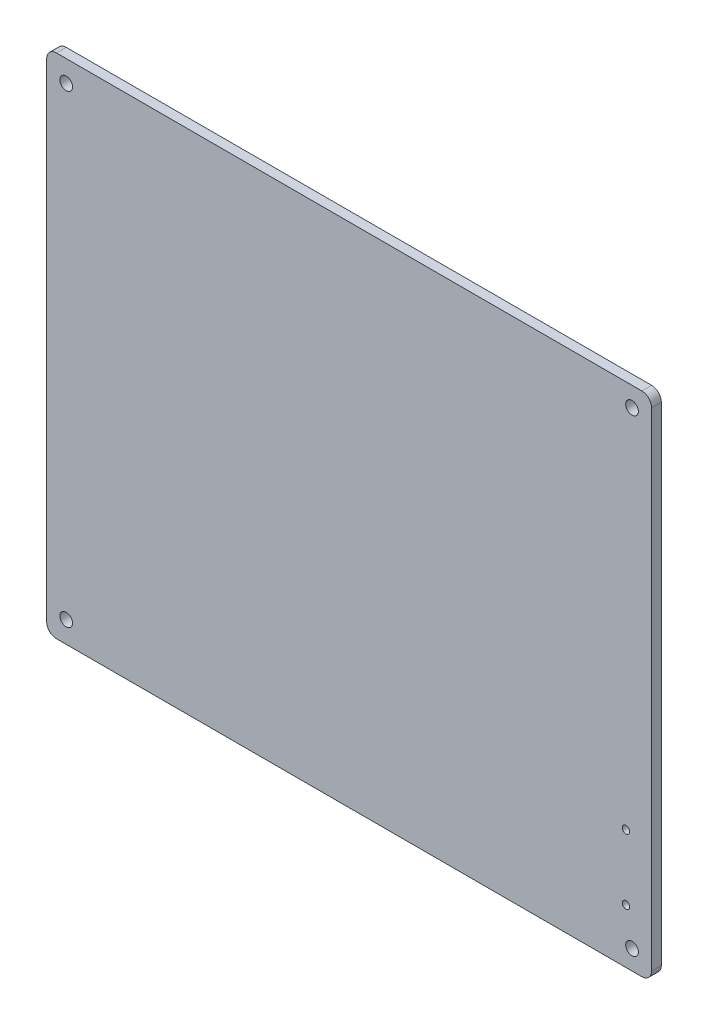
ISO-10303-21;
HEADER;
FILE_DESCRIPTION(('STEP AP214'),'2;1');
FILE_NAME('part.step','',(''),(''),'','','');
FILE_SCHEMA(('AUTOMOTIVE_DESIGN { 1 0 10303 214 1 1 1 1 }'));
ENDSEC;
DATA;
#1=APPLICATION_CONTEXT('core data for automotive mechanical design processes');
#2=APPLICATION_PROTOCOL_DEFINITION('international standard','automotive_design',2000,#1);
#3=PRODUCT_CONTEXT('',#1,'mechanical');
#4=PRODUCT('Part','Part','',(#3));
#5=PRODUCT_RELATED_PRODUCT_CATEGORY('part','',(#4));
#6=PRODUCT_DEFINITION_FORMATION('','',#4);
#7=PRODUCT_DEFINITION_CONTEXT('part definition',#1,'design');
#8=PRODUCT_DEFINITION('design','',#6,#7);
#9=PRODUCT_DEFINITION_SHAPE('','',#8);
#10=(LENGTH_UNIT() NAMED_UNIT(*) SI_UNIT(.MILLI.,.METRE.));
#11=(NAMED_UNIT(*) PLANE_ANGLE_UNIT() SI_UNIT($,.RADIAN.));
#12=(NAMED_UNIT(*) SI_UNIT($,.STERADIAN.) SOLID_ANGLE_UNIT());
#13=UNCERTAINTY_MEASURE_WITH_UNIT(LENGTH_MEASURE(1.E-05),#10,'distance_accuracy_value','');
#14=(GEOMETRIC_REPRESENTATION_CONTEXT(3) GLOBAL_UNCERTAINTY_ASSIGNED_CONTEXT((#13)) GLOBAL_UNIT_ASSIGNED_CONTEXT((#10,
#11,#12)) REPRESENTATION_CONTEXT('',''));
#15=CARTESIAN_POINT('',(0.,0.,0.));
#16=DIRECTION('',(0.,0.,1.));
#17=DIRECTION('',(1.,0.,0.));
#18=AXIS2_PLACEMENT_3D('',#15,#16,#17);
#19=CARTESIAN_POINT('',(-295.,-5.00000000000001,5.));
#20=DIRECTION('',(0.,0.,-1.));
#21=DIRECTION('',(-1.,0.,0.));
#22=AXIS2_PLACEMENT_3D('',#19,#20,#21);
#23=PLANE('',#22);
#24=CARTESIAN_POINT('',(-295.,-5.00000000000001,5.));
#25=DIRECTION('',(0.,0.,1.));
#26=DIRECTION('',(-1.,0.,0.));
#27=AXIS2_PLACEMENT_3D('',#24,#25,#26);
#28=CIRCLE('',#27,5.);
#29=CARTESIAN_POINT('',(-300.,-4.99999999999997,5.));
#30=VERTEX_POINT('',#29);
#31=CARTESIAN_POINT('',(-295.,-10.,5.));
#32=VERTEX_POINT('',#31);
#33=EDGE_CURVE('E152',#30,#32,#28,.T.);
#34=ORIENTED_EDGE('',*,*,#33,.T.);
#35=DIRECTION('',(1.,0.,0.));
#36=VECTOR('',#35,1.);
#37=CARTESIAN_POINT('',(-295.,-10.,5.));
#38=LINE('',#37,#36);
#39=CARTESIAN_POINT('',(4.99999999999997,-10.,5.));
#40=VERTEX_POINT('',#39);
#41=EDGE_CURVE('E100',#32,#40,#38,.T.);
#42=ORIENTED_EDGE('',*,*,#41,.T.);
#43=CARTESIAN_POINT('',(5.00000000000001,-5.00000000000001,5.));
#44=DIRECTION('',(0.,0.,1.));
#45=DIRECTION('',(1.,0.,0.));
#46=AXIS2_PLACEMENT_3D('',#43,#44,#45);
#47=CIRCLE('',#46,5.);
#48=CARTESIAN_POINT('',(10.,-5.00000000000001,5.));
#49=VERTEX_POINT('',#48);
#50=EDGE_CURVE('E167',#40,#49,#47,.T.);
#51=ORIENTED_EDGE('',*,*,#50,.T.);
#52=DIRECTION('',(0.,1.,0.));
#53=VECTOR('',#52,1.);
#54=CARTESIAN_POINT('',(10.,-4.99999999999997,5.));
#55=LINE('',#54,#53);
#56=CARTESIAN_POINT('',(10.,245.,5.));
#57=VERTEX_POINT('',#56);
#58=EDGE_CURVE('E180',#49,#57,#55,.T.);
#59=ORIENTED_EDGE('',*,*,#58,.T.);
#60=CARTESIAN_POINT('',(5.00000000000001,245.,5.));
#61=DIRECTION('',(0.,0.,1.));
#62=DIRECTION('',(-1.,0.,0.));
#63=AXIS2_PLACEMENT_3D('',#60,#61,#62);
#64=CIRCLE('',#63,5.);
#65=CARTESIAN_POINT('',(4.99999999999997,250.,5.));
#66=VERTEX_POINT('',#65);
#67=EDGE_CURVE('E119',#57,#66,#64,.T.);
#68=ORIENTED_EDGE('',*,*,#67,.T.);
#69=DIRECTION('',(-1.,0.,0.));
#70=VECTOR('',#69,1.);
#71=CARTESIAN_POINT('',(-295.,250.,5.));
#72=LINE('',#71,#70);
#73=CARTESIAN_POINT('',(-295.,250.,5.));
#74=VERTEX_POINT('',#73);
#75=EDGE_CURVE('E113',#66,#74,#72,.T.);
#76=ORIENTED_EDGE('',*,*,#75,.T.);
#77=CARTESIAN_POINT('',(-295.,245.,5.));
#78=DIRECTION('',(0.,0.,1.));
#79=DIRECTION('',(-1.,0.,0.));
#80=AXIS2_PLACEMENT_3D('',#77,#78,#79);
#81=CIRCLE('',#80,5.);
#82=CARTESIAN_POINT('',(-300.,245.,5.));
#83=VERTEX_POINT('',#82);
#84=EDGE_CURVE('E117',#74,#83,#81,.T.);
#85=ORIENTED_EDGE('',*,*,#84,.T.);
#86=DIRECTION('',(0.,-1.,0.));
#87=VECTOR('',#86,1.);
#88=CARTESIAN_POINT('',(-300.,-4.99999999999997,5.));
#89=LINE('',#88,#87);
#90=EDGE_CURVE('E57',#83,#30,#89,.T.);
#91=ORIENTED_EDGE('',*,*,#90,.T.);
#92=EDGE_LOOP('',(#34,#42,#51,#59,#68,#76,#85,#91));
#93=FACE_BOUND('',#92,.T.);
#94=CARTESIAN_POINT('',(0.,0.,5.));
#95=DIRECTION('',(0.,0.,1.));
#96=DIRECTION('',(1.,0.,0.));
#97=AXIS2_PLACEMENT_3D('',#94,#95,#96);
#98=CIRCLE('',#97,3.25);
#99=CARTESIAN_POINT('',(3.25,0.,5.));
#100=VERTEX_POINT('',#99);
#101=EDGE_CURVE('E141',#100,#100,#98,.T.);
#102=ORIENTED_EDGE('',*,*,#101,.F.);
#103=EDGE_LOOP('',(#102));
#104=FACE_BOUND('',#103,.T.);
#105=CARTESIAN_POINT('',(0.,240.,5.));
#106=DIRECTION('',(0.,0.,1.));
#107=DIRECTION('',(1.,0.,0.));
#108=AXIS2_PLACEMENT_3D('',#105,#106,#107);
#109=CIRCLE('',#108,3.25);
#110=CARTESIAN_POINT('',(3.25,240.,5.));
#111=VERTEX_POINT('',#110);
#112=EDGE_CURVE('E189',#111,#111,#109,.T.);
#113=ORIENTED_EDGE('',*,*,#112,.F.);
#114=EDGE_LOOP('',(#113));
#115=FACE_BOUND('',#114,.T.);
#116=CARTESIAN_POINT('',(-290.,239.,5.));
#117=DIRECTION('',(0.,0.,1.));
#118=DIRECTION('',(1.,0.,0.));
#119=AXIS2_PLACEMENT_3D('',#116,#117,#118);
#120=CIRCLE('',#119,3.24999999999995);
#121=CARTESIAN_POINT('',(-286.75,239.,5.));
#122=VERTEX_POINT('',#121);
#123=EDGE_CURVE('E195',#122,#122,#120,.T.);
#124=ORIENTED_EDGE('',*,*,#123,.F.);
#125=EDGE_LOOP('',(#124));
#126=FACE_BOUND('',#125,.T.);
#127=CARTESIAN_POINT('',(-290.,1.,5.));
#128=DIRECTION('',(0.,0.,1.));
#129=DIRECTION('',(1.,0.,0.));
#130=AXIS2_PLACEMENT_3D('',#127,#128,#129);
#131=CIRCLE('',#130,3.24999999999995);
#132=CARTESIAN_POINT('',(-286.75,1.,5.));
#133=VERTEX_POINT('',#132);
#134=EDGE_CURVE('E201',#133,#133,#131,.T.);
#135=ORIENTED_EDGE('',*,*,#134,.F.);
#136=EDGE_LOOP('',(#135));
#137=FACE_BOUND('',#136,.T.);
#138=CARTESIAN_POINT('',(-3.10000002888736,17.7826195094828,5.));
#139=DIRECTION('',(0.,0.,1.));
#140=DIRECTION('',(1.,0.,0.));
#141=AXIS2_PLACEMENT_3D('',#138,#139,#140);
#142=CIRCLE('',#141,1.9);
#143=CARTESIAN_POINT('',(-1.20000002888736,17.7826195094828,5.));
#144=VERTEX_POINT('',#143);
#145=EDGE_CURVE('E207',#144,#144,#142,.T.);
#146=ORIENTED_EDGE('',*,*,#145,.F.);
#147=EDGE_LOOP('',(#146));
#148=FACE_BOUND('',#147,.T.);
#149=CARTESIAN_POINT('',(-3.10000002888736,51.2173804905169,5.));
#150=DIRECTION('',(0.,0.,1.));
#151=DIRECTION('',(1.,0.,0.));
#152=AXIS2_PLACEMENT_3D('',#149,#150,#151);
#153=CIRCLE('',#152,1.9);
#154=CARTESIAN_POINT('',(-1.20000002888736,51.2173804905169,5.));
#155=VERTEX_POINT('',#154);
#156=EDGE_CURVE('E213',#155,#155,#153,.T.);
#157=ORIENTED_EDGE('',*,*,#156,.F.);
#158=EDGE_LOOP('',(#157));
#159=FACE_BOUND('',#158,.T.);
#160=ADVANCED_FACE('F40',(#93,#104,#115,#126,#137,#148,#159),#23,.F.);
#161=CARTESIAN_POINT('',(-295.,-5.00000000000001,0.));
#162=DIRECTION('',(0.,0.,-1.));
#163=DIRECTION('',(-1.,0.,0.));
#164=AXIS2_PLACEMENT_3D('',#161,#162,#163);
#165=PLANE('',#164);
#166=CARTESIAN_POINT('',(-3.10000002888736,17.7826195094828,0.));
#167=DIRECTION('',(0.,0.,1.));
#168=DIRECTION('',(1.,0.,0.));
#169=AXIS2_PLACEMENT_3D('',#166,#167,#168);
#170=CIRCLE('',#169,1.9);
#171=CARTESIAN_POINT('',(-1.20000002888736,17.7826195094828,0.));
#172=VERTEX_POINT('',#171);
#173=EDGE_CURVE('E210',#172,#172,#170,.T.);
#174=ORIENTED_EDGE('',*,*,#173,.T.);
#175=EDGE_LOOP('',(#174));
#176=FACE_BOUND('',#175,.T.);
#177=CARTESIAN_POINT('',(-290.,239.,0.));
#178=DIRECTION('',(0.,0.,1.));
#179=DIRECTION('',(1.,0.,0.));
#180=AXIS2_PLACEMENT_3D('',#177,#178,#179);
#181=CIRCLE('',#180,3.24999999999995);
#182=CARTESIAN_POINT('',(-286.75,239.,0.));
#183=VERTEX_POINT('',#182);
#184=EDGE_CURVE('E198',#183,#183,#181,.T.);
#185=ORIENTED_EDGE('',*,*,#184,.T.);
#186=EDGE_LOOP('',(#185));
#187=FACE_BOUND('',#186,.T.);
#188=CARTESIAN_POINT('',(0.,0.,0.));
#189=DIRECTION('',(0.,0.,1.));
#190=DIRECTION('',(1.,0.,0.));
#191=AXIS2_PLACEMENT_3D('',#188,#189,#190);
#192=CIRCLE('',#191,3.25);
#193=CARTESIAN_POINT('',(3.25,0.,0.));
#194=VERTEX_POINT('',#193);
#195=EDGE_CURVE('E186',#194,#194,#192,.T.);
#196=ORIENTED_EDGE('',*,*,#195,.T.);
#197=EDGE_LOOP('',(#196));
#198=FACE_BOUND('',#197,.T.);
#199=CARTESIAN_POINT('',(-295.,-5.00000000000001,0.));
#200=DIRECTION('',(0.,0.,1.));
#201=DIRECTION('',(-1.,0.,0.));
#202=AXIS2_PLACEMENT_3D('',#199,#200,#201);
#203=CIRCLE('',#202,5.);
#204=CARTESIAN_POINT('',(-300.,-4.99999999999997,0.));
#205=VERTEX_POINT('',#204);
#206=CARTESIAN_POINT('',(-295.,-10.,0.));
#207=VERTEX_POINT('',#206);
#208=EDGE_CURVE('E137',#205,#207,#203,.T.);
#209=ORIENTED_EDGE('',*,*,#208,.F.);
#210=DIRECTION('',(0.,-1.,0.));
#211=VECTOR('',#210,1.);
#212=CARTESIAN_POINT('',(-300.,-4.99999999999997,0.));
#213=LINE('',#212,#211);
#214=CARTESIAN_POINT('',(-300.,245.,0.));
#215=VERTEX_POINT('',#214);
#216=EDGE_CURVE('E92',#215,#205,#213,.T.);
#217=ORIENTED_EDGE('',*,*,#216,.F.);
#218=CARTESIAN_POINT('',(-295.,245.,0.));
#219=DIRECTION('',(0.,0.,1.));
#220=DIRECTION('',(-1.,0.,0.));
#221=AXIS2_PLACEMENT_3D('',#218,#219,#220);
#222=CIRCLE('',#221,5.);
#223=CARTESIAN_POINT('',(-295.,250.,0.));
#224=VERTEX_POINT('',#223);
#225=EDGE_CURVE('E86',#224,#215,#222,.T.);
#226=ORIENTED_EDGE('',*,*,#225,.F.);
#227=DIRECTION('',(-1.,0.,0.));
#228=VECTOR('',#227,1.);
#229=CARTESIAN_POINT('',(-295.,250.,0.));
#230=LINE('',#229,#228);
#231=CARTESIAN_POINT('',(4.99999999999997,250.,0.));
#232=VERTEX_POINT('',#231);
#233=EDGE_CURVE('E127',#232,#224,#230,.T.);
#234=ORIENTED_EDGE('',*,*,#233,.F.);
#235=CARTESIAN_POINT('',(5.00000000000001,245.,0.));
#236=DIRECTION('',(0.,0.,1.));
#237=DIRECTION('',(-1.,0.,0.));
#238=AXIS2_PLACEMENT_3D('',#235,#236,#237);
#239=CIRCLE('',#238,5.);
#240=CARTESIAN_POINT('',(10.,245.,0.));
#241=VERTEX_POINT('',#240);
#242=EDGE_CURVE('E147',#241,#232,#239,.T.);
#243=ORIENTED_EDGE('',*,*,#242,.F.);
#244=DIRECTION('',(0.,1.,0.));
#245=VECTOR('',#244,1.);
#246=CARTESIAN_POINT('',(10.,-4.99999999999997,0.));
#247=LINE('',#246,#245);
#248=CARTESIAN_POINT('',(10.,-5.00000000000001,0.));
#249=VERTEX_POINT('',#248);
#250=EDGE_CURVE('E145',#249,#241,#247,.T.);
#251=ORIENTED_EDGE('',*,*,#250,.F.);
#252=CARTESIAN_POINT('',(5.00000000000001,-5.00000000000001,0.));
#253=DIRECTION('',(0.,0.,1.));
#254=DIRECTION('',(1.,0.,0.));
#255=AXIS2_PLACEMENT_3D('',#252,#253,#254);
#256=CIRCLE('',#255,5.);
#257=CARTESIAN_POINT('',(4.99999999999997,-10.,0.));
#258=VERTEX_POINT('',#257);
#259=EDGE_CURVE('E143',#258,#249,#256,.T.);
#260=ORIENTED_EDGE('',*,*,#259,.F.);
#261=DIRECTION('',(1.,0.,0.));
#262=VECTOR('',#261,1.);
#263=CARTESIAN_POINT('',(-295.,-10.,0.));
#264=LINE('',#263,#262);
#265=EDGE_CURVE('E140',#207,#258,#264,.T.);
#266=ORIENTED_EDGE('',*,*,#265,.F.);
#267=EDGE_LOOP('',(#209,#217,#226,#234,#243,#251,#260,#266));
#268=FACE_BOUND('',#267,.T.);
#269=CARTESIAN_POINT('',(0.,240.,0.));
#270=DIRECTION('',(0.,0.,1.));
#271=DIRECTION('',(1.,0.,0.));
#272=AXIS2_PLACEMENT_3D('',#269,#270,#271);
#273=CIRCLE('',#272,3.25);
#274=CARTESIAN_POINT('',(3.25,240.,0.));
#275=VERTEX_POINT('',#274);
#276=EDGE_CURVE('E192',#275,#275,#273,.T.);
#277=ORIENTED_EDGE('',*,*,#276,.T.);
#278=EDGE_LOOP('',(#277));
#279=FACE_BOUND('',#278,.T.);
#280=CARTESIAN_POINT('',(-290.,1.,0.));
#281=DIRECTION('',(0.,0.,1.));
#282=DIRECTION('',(1.,0.,0.));
#283=AXIS2_PLACEMENT_3D('',#280,#281,#282);
#284=CIRCLE('',#283,3.24999999999995);
#285=CARTESIAN_POINT('',(-286.75,1.,0.));
#286=VERTEX_POINT('',#285);
#287=EDGE_CURVE('E204',#286,#286,#284,.T.);
#288=ORIENTED_EDGE('',*,*,#287,.T.);
#289=EDGE_LOOP('',(#288));
#290=FACE_BOUND('',#289,.T.);
#291=CARTESIAN_POINT('',(-3.10000002888736,51.2173804905169,0.));
#292=DIRECTION('',(0.,0.,1.));
#293=DIRECTION('',(1.,0.,0.));
#294=AXIS2_PLACEMENT_3D('',#291,#292,#293);
#295=CIRCLE('',#294,1.9);
#296=CARTESIAN_POINT('',(-1.20000002888736,51.2173804905169,0.));
#297=VERTEX_POINT('',#296);
#298=EDGE_CURVE('E216',#297,#297,#295,.T.);
#299=ORIENTED_EDGE('',*,*,#298,.T.);
#300=EDGE_LOOP('',(#299));
#301=FACE_BOUND('',#300,.T.);
#302=ADVANCED_FACE('F171',(#176,#187,#198,#268,#279,#290,#301),#165,.T.);
#303=CARTESIAN_POINT('',(-295.,-5.00000000000001,5.));
#304=DIRECTION('',(0.,0.,-1.));
#305=DIRECTION('',(-1.,0.,0.));
#306=AXIS2_PLACEMENT_3D('',#303,#304,#305);
#307=CYLINDRICAL_SURFACE('',#306,5.);
#308=ORIENTED_EDGE('',*,*,#208,.T.);
#309=DIRECTION('',(0.,0.,-1.));
#310=VECTOR('',#309,1.);
#311=CARTESIAN_POINT('',(-295.,-10.,5.));
#312=LINE('',#311,#310);
#313=EDGE_CURVE('E11',#32,#207,#312,.T.);
#314=ORIENTED_EDGE('',*,*,#313,.F.);
#315=ORIENTED_EDGE('',*,*,#33,.F.);
#316=DIRECTION('',(0.,0.,-1.));
#317=VECTOR('',#316,1.);
#318=CARTESIAN_POINT('',(-300.,-4.99999999999997,5.));
#319=LINE('',#318,#317);
#320=EDGE_CURVE('E133',#30,#205,#319,.T.);
#321=ORIENTED_EDGE('',*,*,#320,.T.);
#322=EDGE_LOOP('',(#308,#314,#315,#321));
#323=FACE_BOUND('',#322,.T.);
#324=ADVANCED_FACE('F42',(#323),#307,.T.);
#325=CARTESIAN_POINT('',(-295.,-10.,5.));
#326=DIRECTION('',(0.,1.,0.));
#327=DIRECTION('',(0.,0.,1.));
#328=AXIS2_PLACEMENT_3D('',#325,#326,#327);
#329=PLANE('',#328);
#330=ORIENTED_EDGE('',*,*,#265,.T.);
#331=DIRECTION('',(0.,0.,-1.));
#332=VECTOR('',#331,1.);
#333=CARTESIAN_POINT('',(4.99999999999997,-10.,5.));
#334=LINE('',#333,#332);
#335=EDGE_CURVE('E49',#40,#258,#334,.T.);
#336=ORIENTED_EDGE('',*,*,#335,.F.);
#337=ORIENTED_EDGE('',*,*,#41,.F.);
#338=ORIENTED_EDGE('',*,*,#313,.T.);
#339=EDGE_LOOP('',(#330,#336,#337,#338));
#340=FACE_BOUND('',#339,.T.);
#341=ADVANCED_FACE('F248',(#340),#329,.F.);
#342=CARTESIAN_POINT('',(5.00000000000001,-5.00000000000001,5.));
#343=DIRECTION('',(0.,0.,-1.));
#344=DIRECTION('',(-1.,0.,0.));
#345=AXIS2_PLACEMENT_3D('',#342,#343,#344);
#346=CYLINDRICAL_SURFACE('',#345,5.);
#347=ORIENTED_EDGE('',*,*,#259,.T.);
#348=DIRECTION('',(0.,0.,-1.));
#349=VECTOR('',#348,1.);
#350=CARTESIAN_POINT('',(10.,-5.00000000000001,5.));
#351=LINE('',#350,#349);
#352=EDGE_CURVE('E159',#49,#249,#351,.T.);
#353=ORIENTED_EDGE('',*,*,#352,.F.);
#354=ORIENTED_EDGE('',*,*,#50,.F.);
#355=ORIENTED_EDGE('',*,*,#335,.T.);
#356=EDGE_LOOP('',(#347,#353,#354,#355));
#357=FACE_BOUND('',#356,.T.);
#358=ADVANCED_FACE('F165',(#357),#346,.T.);
#359=CARTESIAN_POINT('',(10.,-4.99999999999997,5.));
#360=DIRECTION('',(-1.,0.,0.));
#361=DIRECTION('',(0.,0.,1.));
#362=AXIS2_PLACEMENT_3D('',#359,#360,#361);
#363=PLANE('',#362);
#364=ORIENTED_EDGE('',*,*,#250,.T.);
#365=DIRECTION('',(0.,0.,-1.));
#366=VECTOR('',#365,1.);
#367=CARTESIAN_POINT('',(10.,245.,5.));
#368=LINE('',#367,#366);
#369=EDGE_CURVE('E156',#57,#241,#368,.T.);
#370=ORIENTED_EDGE('',*,*,#369,.F.);
#371=ORIENTED_EDGE('',*,*,#58,.F.);
#372=ORIENTED_EDGE('',*,*,#352,.T.);
#373=EDGE_LOOP('',(#364,#370,#371,#372));
#374=FACE_BOUND('',#373,.T.);
#375=ADVANCED_FACE('F176',(#374),#363,.F.);
#376=CARTESIAN_POINT('',(5.00000000000001,245.,5.));
#377=DIRECTION('',(0.,0.,-1.));
#378=DIRECTION('',(-1.,0.,0.));
#379=AXIS2_PLACEMENT_3D('',#376,#377,#378);
#380=CYLINDRICAL_SURFACE('',#379,5.);
#381=ORIENTED_EDGE('',*,*,#242,.T.);
#382=DIRECTION('',(0.,0.,-1.));
#383=VECTOR('',#382,1.);
#384=CARTESIAN_POINT('',(4.99999999999997,250.,5.));
#385=LINE('',#384,#383);
#386=EDGE_CURVE('E128',#66,#232,#385,.T.);
#387=ORIENTED_EDGE('',*,*,#386,.F.);
#388=ORIENTED_EDGE('',*,*,#67,.F.);
#389=ORIENTED_EDGE('',*,*,#369,.T.);
#390=EDGE_LOOP('',(#381,#387,#388,#389));
#391=FACE_BOUND('',#390,.T.);
#392=ADVANCED_FACE('F179',(#391),#380,.T.);
#393=CARTESIAN_POINT('',(-295.,250.,5.));
#394=DIRECTION('',(0.,-1.,0.));
#395=DIRECTION('',(0.,0.,-1.));
#396=AXIS2_PLACEMENT_3D('',#393,#394,#395);
#397=PLANE('',#396);
#398=ORIENTED_EDGE('',*,*,#233,.T.);
#399=DIRECTION('',(0.,0.,-1.));
#400=VECTOR('',#399,1.);
#401=CARTESIAN_POINT('',(-295.,250.,5.));
#402=LINE('',#401,#400);
#403=EDGE_CURVE('E124',#74,#224,#402,.T.);
#404=ORIENTED_EDGE('',*,*,#403,.F.);
#405=ORIENTED_EDGE('',*,*,#75,.F.);
#406=ORIENTED_EDGE('',*,*,#386,.T.);
#407=EDGE_LOOP('',(#398,#404,#405,#406));
#408=FACE_BOUND('',#407,.T.);
#409=ADVANCED_FACE('F125',(#408),#397,.F.);
#410=CARTESIAN_POINT('',(-295.,245.,5.));
#411=DIRECTION('',(0.,0.,-1.));
#412=DIRECTION('',(-1.,0.,0.));
#413=AXIS2_PLACEMENT_3D('',#410,#411,#412);
#414=CYLINDRICAL_SURFACE('',#413,5.);
#415=ORIENTED_EDGE('',*,*,#225,.T.);
#416=DIRECTION('',(0.,0.,-1.));
#417=VECTOR('',#416,1.);
#418=CARTESIAN_POINT('',(-300.,245.,5.));
#419=LINE('',#418,#417);
#420=EDGE_CURVE('E129',#83,#215,#419,.T.);
#421=ORIENTED_EDGE('',*,*,#420,.F.);
#422=ORIENTED_EDGE('',*,*,#84,.F.);
#423=ORIENTED_EDGE('',*,*,#403,.T.);
#424=EDGE_LOOP('',(#415,#421,#422,#423));
#425=FACE_BOUND('',#424,.T.);
#426=ADVANCED_FACE('F131',(#425),#414,.T.);
#427=CARTESIAN_POINT('',(-300.,-4.99999999999997,5.));
#428=DIRECTION('',(1.,0.,0.));
#429=DIRECTION('',(0.,0.,-1.));
#430=AXIS2_PLACEMENT_3D('',#427,#428,#429);
#431=PLANE('',#430);
#432=ORIENTED_EDGE('',*,*,#216,.T.);
#433=ORIENTED_EDGE('',*,*,#320,.F.);
#434=ORIENTED_EDGE('',*,*,#90,.F.);
#435=ORIENTED_EDGE('',*,*,#420,.T.);
#436=EDGE_LOOP('',(#432,#433,#434,#435));
#437=FACE_BOUND('',#436,.T.);
#438=ADVANCED_FACE('F236',(#437),#431,.F.);
#439=CARTESIAN_POINT('',(0.,0.,5.));
#440=DIRECTION('',(0.,0.,-1.));
#441=DIRECTION('',(-1.,0.,0.));
#442=AXIS2_PLACEMENT_3D('',#439,#440,#441);
#443=CYLINDRICAL_SURFACE('',#442,3.25);
#444=ORIENTED_EDGE('',*,*,#101,.T.);
#445=EDGE_LOOP('',(#444));
#446=FACE_BOUND('',#445,.T.);
#447=ORIENTED_EDGE('',*,*,#195,.F.);
#448=EDGE_LOOP('',(#447));
#449=FACE_BOUND('',#448,.T.);
#450=ADVANCED_FACE('F233',(#446,#449),#443,.F.);
#451=CARTESIAN_POINT('',(0.,240.,5.));
#452=DIRECTION('',(0.,0.,-1.));
#453=DIRECTION('',(-1.,0.,0.));
#454=AXIS2_PLACEMENT_3D('',#451,#452,#453);
#455=CYLINDRICAL_SURFACE('',#454,3.25);
#456=ORIENTED_EDGE('',*,*,#112,.T.);
#457=EDGE_LOOP('',(#456));
#458=FACE_BOUND('',#457,.T.);
#459=ORIENTED_EDGE('',*,*,#276,.F.);
#460=EDGE_LOOP('',(#459));
#461=FACE_BOUND('',#460,.T.);
#462=ADVANCED_FACE('F324',(#458,#461),#455,.F.);
#463=CARTESIAN_POINT('',(-290.,239.,5.));
#464=DIRECTION('',(0.,0.,-1.));
#465=DIRECTION('',(-1.,0.,0.));
#466=AXIS2_PLACEMENT_3D('',#463,#464,#465);
#467=CYLINDRICAL_SURFACE('',#466,3.24999999999995);
#468=ORIENTED_EDGE('',*,*,#123,.T.);
#469=EDGE_LOOP('',(#468));
#470=FACE_BOUND('',#469,.T.);
#471=ORIENTED_EDGE('',*,*,#184,.F.);
#472=EDGE_LOOP('',(#471));
#473=FACE_BOUND('',#472,.T.);
#474=ADVANCED_FACE('F333',(#470,#473),#467,.F.);
#475=CARTESIAN_POINT('',(-290.,1.,5.));
#476=DIRECTION('',(0.,0.,-1.));
#477=DIRECTION('',(-1.,0.,0.));
#478=AXIS2_PLACEMENT_3D('',#475,#476,#477);
#479=CYLINDRICAL_SURFACE('',#478,3.24999999999995);
#480=ORIENTED_EDGE('',*,*,#134,.T.);
#481=EDGE_LOOP('',(#480));
#482=FACE_BOUND('',#481,.T.);
#483=ORIENTED_EDGE('',*,*,#287,.F.);
#484=EDGE_LOOP('',(#483));
#485=FACE_BOUND('',#484,.T.);
#486=ADVANCED_FACE('F342',(#482,#485),#479,.F.);
#487=CARTESIAN_POINT('',(-3.10000002888736,17.7826195094828,5.));
#488=DIRECTION('',(0.,0.,-1.));
#489=DIRECTION('',(-1.,0.,0.));
#490=AXIS2_PLACEMENT_3D('',#487,#488,#489);
#491=CYLINDRICAL_SURFACE('',#490,1.9);
#492=ORIENTED_EDGE('',*,*,#145,.T.);
#493=EDGE_LOOP('',(#492));
#494=FACE_BOUND('',#493,.T.);
#495=ORIENTED_EDGE('',*,*,#173,.F.);
#496=EDGE_LOOP('',(#495));
#497=FACE_BOUND('',#496,.T.);
#498=ADVANCED_FACE('F352',(#494,#497),#491,.F.);
#499=CARTESIAN_POINT('',(-3.10000002888736,51.2173804905169,5.));
#500=DIRECTION('',(0.,0.,-1.));
#501=DIRECTION('',(-1.,0.,0.));
#502=AXIS2_PLACEMENT_3D('',#499,#500,#501);
#503=CYLINDRICAL_SURFACE('',#502,1.9);
#504=ORIENTED_EDGE('',*,*,#156,.T.);
#505=EDGE_LOOP('',(#504));
#506=FACE_BOUND('',#505,.T.);
#507=ORIENTED_EDGE('',*,*,#298,.F.);
#508=EDGE_LOOP('',(#507));
#509=FACE_BOUND('',#508,.T.);
#510=ADVANCED_FACE('F222',(#506,#509),#503,.F.);
#511=CLOSED_SHELL('',(#160,#302,#324,#341,#358,#375,#392,#409,#426,#438,#450,#462,#474,#486,
#498,#510));
#512=MANIFOLD_SOLID_BREP('B2',#511);
#513=ADVANCED_BREP_SHAPE_REPRESENTATION('',(#18,#512),#14);
#514=SHAPE_DEFINITION_REPRESENTATION(#9,#513);
ENDSEC;
END-ISO-10303-21;
